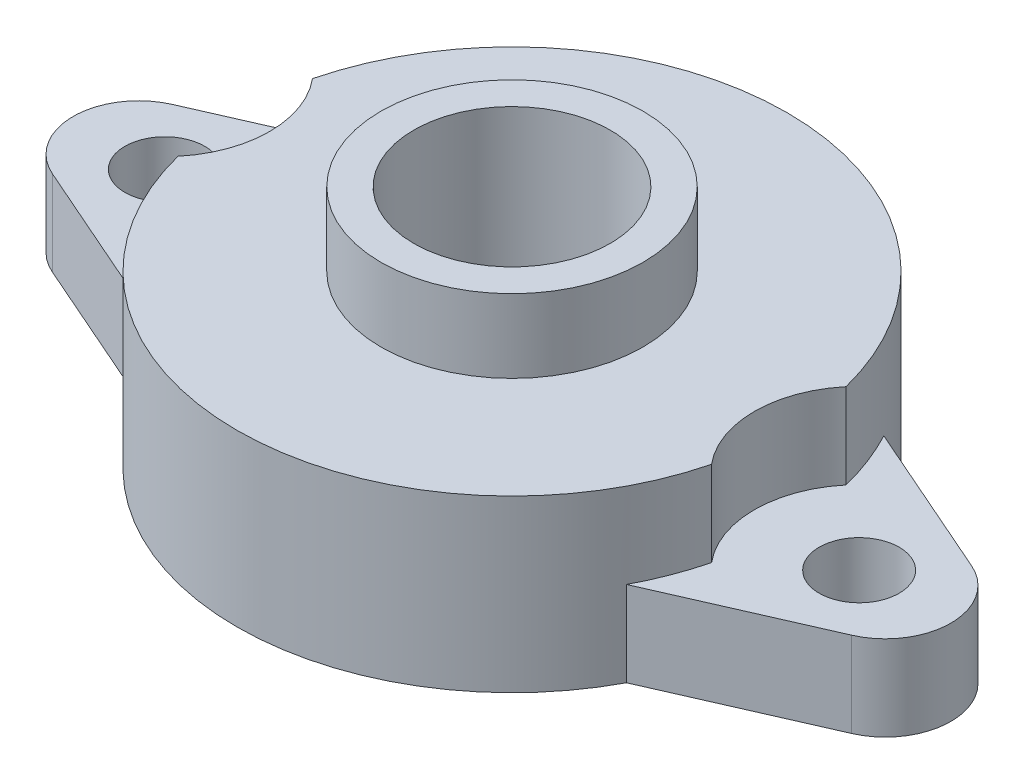
ISO-10303-21;
HEADER;
FILE_DESCRIPTION(('STEP AP214'),'2;1');
FILE_NAME('part.step','',(''),(''),'','','');
FILE_SCHEMA(('AUTOMOTIVE_DESIGN { 1 0 10303 214 1 1 1 1 }'));
ENDSEC;
DATA;
#1=APPLICATION_CONTEXT('core data for automotive mechanical design processes');
#2=APPLICATION_PROTOCOL_DEFINITION('international standard','automotive_design',2000,#1);
#3=PRODUCT_CONTEXT('',#1,'mechanical');
#4=PRODUCT('Part','Part','',(#3));
#5=PRODUCT_RELATED_PRODUCT_CATEGORY('part','',(#4));
#6=PRODUCT_DEFINITION_FORMATION('','',#4);
#7=PRODUCT_DEFINITION_CONTEXT('part definition',#1,'design');
#8=PRODUCT_DEFINITION('design','',#6,#7);
#9=PRODUCT_DEFINITION_SHAPE('','',#8);
#10=(LENGTH_UNIT() NAMED_UNIT(*) SI_UNIT(.MILLI.,.METRE.));
#11=(NAMED_UNIT(*) PLANE_ANGLE_UNIT() SI_UNIT($,.RADIAN.));
#12=(NAMED_UNIT(*) SI_UNIT($,.STERADIAN.) SOLID_ANGLE_UNIT());
#13=UNCERTAINTY_MEASURE_WITH_UNIT(LENGTH_MEASURE(1.E-05),#10,'distance_accuracy_value','');
#14=(GEOMETRIC_REPRESENTATION_CONTEXT(3) GLOBAL_UNCERTAINTY_ASSIGNED_CONTEXT((#13)) GLOBAL_UNIT_ASSIGNED_CONTEXT((#10,
#11,#12)) REPRESENTATION_CONTEXT('',''));
#15=CARTESIAN_POINT('',(0.,0.,0.));
#16=DIRECTION('',(0.,0.,1.));
#17=DIRECTION('',(1.,0.,0.));
#18=AXIS2_PLACEMENT_3D('',#15,#16,#17);
#19=CARTESIAN_POINT('',(0.,6.5,0.));
#20=DIRECTION('',(0.,1.,0.));
#21=DIRECTION('',(0.,0.,1.));
#22=AXIS2_PLACEMENT_3D('',#19,#20,#21);
#23=PLANE('',#22);
#24=CARTESIAN_POINT('',(-26.5,6.5,0.));
#25=DIRECTION('',(0.,1.,0.));
#26=DIRECTION('',(0.,0.,1.));
#27=AXIS2_PLACEMENT_3D('',#24,#25,#26);
#28=CIRCLE('',#27,3.05);
#29=CARTESIAN_POINT('',(-26.5,6.5,-3.04999999999999));
#30=VERTEX_POINT('',#29);
#31=EDGE_CURVE('E195',#30,#30,#28,.T.);
#32=ORIENTED_EDGE('',*,*,#31,.F.);
#33=EDGE_LOOP('',(#32));
#34=FACE_BOUND('',#33,.T.);
#35=CARTESIAN_POINT('',(0.,6.5,0.));
#36=DIRECTION('',(0.,1.,0.));
#37=DIRECTION('',(0.,0.,1.));
#38=AXIS2_PLACEMENT_3D('',#35,#36,#37);
#39=CIRCLE('',#38,21.);
#40=CARTESIAN_POINT('',(-20.3632075471698,6.5,5.13222937824164));
#41=VERTEX_POINT('',#40);
#42=CARTESIAN_POINT('',(-18.5617616197673,6.5,9.8214563874678));
#43=VERTEX_POINT('',#42);
#44=EDGE_CURVE('E63',#41,#43,#39,.T.);
#45=ORIENTED_EDGE('',*,*,#44,.F.);
#46=CARTESIAN_POINT('',(-26.5,6.5,0.));
#47=DIRECTION('',(0.,-1.,0.));
#48=DIRECTION('',(0.,0.,1.));
#49=AXIS2_PLACEMENT_3D('',#46,#47,#48);
#50=CIRCLE('',#49,8.);
#51=CARTESIAN_POINT('',(-20.3632075471698,6.5,-5.13222937824163));
#52=VERTEX_POINT('',#51);
#53=EDGE_CURVE('E67',#52,#41,#50,.T.);
#54=ORIENTED_EDGE('',*,*,#53,.F.);
#55=CARTESIAN_POINT('',(0.,6.5,0.));
#56=DIRECTION('',(0.,1.,0.));
#57=DIRECTION('',(0.,0.,1.));
#58=AXIS2_PLACEMENT_3D('',#55,#56,#57);
#59=CIRCLE('',#58,21.);
#60=CARTESIAN_POINT('',(-18.5617616197673,6.5,-9.8214563874678));
#61=VERTEX_POINT('',#60);
#62=EDGE_CURVE('E55',#61,#52,#59,.T.);
#63=ORIENTED_EDGE('',*,*,#62,.F.);
#64=DIRECTION('',(0.91570918494553,0.,-0.401841621296741));
#65=VECTOR('',#64,1.);
#66=CARTESIAN_POINT('',(-6.61129373176592,6.5,-15.0656927349003));
#67=LINE('',#66,#65);
#68=CARTESIAN_POINT('',(-30.5092081064837,6.5,-4.57854592472766));
#69=VERTEX_POINT('',#68);
#70=EDGE_CURVE('E184',#69,#61,#67,.T.);
#71=ORIENTED_EDGE('',*,*,#70,.F.);
#72=CARTESIAN_POINT('',(-28.5,6.5,0.));
#73=DIRECTION('',(0.,1.,0.));
#74=DIRECTION('',(0.,0.,1.));
#75=AXIS2_PLACEMENT_3D('',#72,#73,#74);
#76=CIRCLE('',#75,5.00000000000001);
#77=CARTESIAN_POINT('',(-30.5092081064837,6.5,4.57854592472766));
#78=VERTEX_POINT('',#77);
#79=EDGE_CURVE('E188',#78,#69,#76,.F.);
#80=ORIENTED_EDGE('',*,*,#79,.F.);
#81=DIRECTION('',(0.91570918494553,0.,0.401841621296741));
#82=VECTOR('',#81,1.);
#83=CARTESIAN_POINT('',(-6.61129373176592,6.5,15.0656927349003));
#84=LINE('',#83,#82);
#85=EDGE_CURVE('E192',#78,#43,#84,.T.);
#86=ORIENTED_EDGE('',*,*,#85,.T.);
#87=EDGE_LOOP('',(#45,#54,#63,#71,#80,#86));
#88=FACE_BOUND('',#87,.T.);
#89=ADVANCED_FACE('F45',(#34,#88),#23,.T.);
#90=CARTESIAN_POINT('',(26.5,6.5,0.));
#91=DIRECTION('',(0.,1.,0.));
#92=DIRECTION('',(0.,0.,1.));
#93=AXIS2_PLACEMENT_3D('',#90,#91,#92);
#94=CIRCLE('',#93,3.05);
#95=CARTESIAN_POINT('',(26.5,6.5,-3.05000000000001));
#96=VERTEX_POINT('',#95);
#97=EDGE_CURVE('E199',#96,#96,#94,.T.);
#98=ORIENTED_EDGE('',*,*,#97,.F.);
#99=EDGE_LOOP('',(#98));
#100=FACE_BOUND('',#99,.T.);
#101=CARTESIAN_POINT('',(18.5617616197674,6.5,9.82145638746779));
#102=VERTEX_POINT('',#101);
#103=CARTESIAN_POINT('',(20.3632075471698,6.5,5.13222937824163));
#104=VERTEX_POINT('',#103);
#105=EDGE_CURVE('E161',#102,#104,#39,.T.);
#106=ORIENTED_EDGE('',*,*,#105,.F.);
#107=DIRECTION('',(-0.91570918494553,0.,0.401841621296741));
#108=VECTOR('',#107,1.);
#109=CARTESIAN_POINT('',(6.61129373176592,6.5,15.0656927349003));
#110=LINE('',#109,#108);
#111=CARTESIAN_POINT('',(30.5092081064837,6.5,4.57854592472766));
#112=VERTEX_POINT('',#111);
#113=EDGE_CURVE('E173',#112,#102,#110,.T.);
#114=ORIENTED_EDGE('',*,*,#113,.F.);
#115=CARTESIAN_POINT('',(28.5,6.5,0.));
#116=DIRECTION('',(0.,1.,0.));
#117=DIRECTION('',(0.,0.,1.));
#118=AXIS2_PLACEMENT_3D('',#115,#116,#117);
#119=CIRCLE('',#118,5.00000000000001);
#120=CARTESIAN_POINT('',(30.5092081064837,6.5,-4.57854592472766));
#121=VERTEX_POINT('',#120);
#122=EDGE_CURVE('E177',#112,#121,#119,.T.);
#123=ORIENTED_EDGE('',*,*,#122,.T.);
#124=DIRECTION('',(-0.91570918494553,0.,-0.401841621296741));
#125=VECTOR('',#124,1.);
#126=CARTESIAN_POINT('',(6.61129373176592,6.5,-15.0656927349003));
#127=LINE('',#126,#125);
#128=CARTESIAN_POINT('',(18.5617616197674,6.5,-9.82145638746779));
#129=VERTEX_POINT('',#128);
#130=EDGE_CURVE('E181',#121,#129,#127,.T.);
#131=ORIENTED_EDGE('',*,*,#130,.T.);
#132=CARTESIAN_POINT('',(20.3632075471698,6.5,-5.13222937824164));
#133=VERTEX_POINT('',#132);
#134=EDGE_CURVE('E266',#133,#129,#59,.T.);
#135=ORIENTED_EDGE('',*,*,#134,.F.);
#136=CARTESIAN_POINT('',(26.5,6.5,0.));
#137=DIRECTION('',(0.,-1.,0.));
#138=DIRECTION('',(0.,0.,1.));
#139=AXIS2_PLACEMENT_3D('',#136,#137,#138);
#140=CIRCLE('',#139,8.);
#141=EDGE_CURVE('E270',#104,#133,#140,.T.);
#142=ORIENTED_EDGE('',*,*,#141,.F.);
#143=EDGE_LOOP('',(#106,#114,#123,#131,#135,#142));
#144=FACE_BOUND('',#143,.T.);
#145=ADVANCED_FACE('F301',(#100,#144),#23,.T.);
#146=CARTESIAN_POINT('',(0.,6.5,0.));
#147=DIRECTION('',(0.,-1.,0.));
#148=DIRECTION('',(0.,0.,-1.));
#149=AXIS2_PLACEMENT_3D('',#146,#147,#148);
#150=CYLINDRICAL_SURFACE('',#149,21.);
#151=CARTESIAN_POINT('',(0.,0.,0.));
#152=DIRECTION('',(0.,1.,0.));
#153=DIRECTION('',(0.,0.,1.));
#154=AXIS2_PLACEMENT_3D('',#151,#152,#153);
#155=CIRCLE('',#154,21.);
#156=CARTESIAN_POINT('',(-18.5617616197673,0.,9.8214563874678));
#157=VERTEX_POINT('',#156);
#158=CARTESIAN_POINT('',(18.5617616197674,0.,9.82145638746779));
#159=VERTEX_POINT('',#158);
#160=EDGE_CURVE('E163',#157,#159,#155,.T.);
#161=ORIENTED_EDGE('',*,*,#160,.T.);
#162=DIRECTION('',(0.,-1.,0.));
#163=VECTOR('',#162,1.);
#164=CARTESIAN_POINT('',(18.5617616197674,6.5,9.82145638746779));
#165=LINE('',#164,#163);
#166=EDGE_CURVE('E49',#102,#159,#165,.T.);
#167=ORIENTED_EDGE('',*,*,#166,.F.);
#168=ORIENTED_EDGE('',*,*,#105,.T.);
#169=DIRECTION('',(0.,-1.,0.));
#170=VECTOR('',#169,1.);
#171=CARTESIAN_POINT('',(20.3632075471698,13.,5.13222937824163));
#172=LINE('',#171,#170);
#173=CARTESIAN_POINT('',(20.3632075471698,13.,5.13222937824163));
#174=VERTEX_POINT('',#173);
#175=EDGE_CURVE('E140',#174,#104,#172,.T.);
#176=ORIENTED_EDGE('',*,*,#175,.F.);
#177=CARTESIAN_POINT('',(0.,13.,0.));
#178=DIRECTION('',(0.,1.,0.));
#179=DIRECTION('',(0.,0.,1.));
#180=AXIS2_PLACEMENT_3D('',#177,#178,#179);
#181=CIRCLE('',#180,21.);
#182=CARTESIAN_POINT('',(-20.3632075471698,13.,5.13222937824164));
#183=VERTEX_POINT('',#182);
#184=EDGE_CURVE('E147',#183,#174,#181,.T.);
#185=ORIENTED_EDGE('',*,*,#184,.F.);
#186=DIRECTION('',(0.,-1.,0.));
#187=VECTOR('',#186,1.);
#188=CARTESIAN_POINT('',(-20.3632075471698,13.,5.13222937824164));
#189=LINE('',#188,#187);
#190=EDGE_CURVE('E287',#183,#41,#189,.T.);
#191=ORIENTED_EDGE('',*,*,#190,.T.);
#192=ORIENTED_EDGE('',*,*,#44,.T.);
#193=DIRECTION('',(0.,-1.,0.));
#194=VECTOR('',#193,1.);
#195=CARTESIAN_POINT('',(-18.5617616197673,6.5,9.8214563874678));
#196=LINE('',#195,#194);
#197=EDGE_CURVE('E202',#43,#157,#196,.T.);
#198=ORIENTED_EDGE('',*,*,#197,.T.);
#199=EDGE_LOOP('',(#161,#167,#168,#176,#185,#191,#192,#198));
#200=FACE_BOUND('',#199,.T.);
#201=ADVANCED_FACE('F47',(#200),#150,.T.);
#202=CARTESIAN_POINT('',(6.61129373176592,6.5,15.0656927349003));
#203=DIRECTION('',(0.401841621296741,0.,0.91570918494553));
#204=DIRECTION('',(0.91570918494553,0.,-0.401841621296741));
#205=AXIS2_PLACEMENT_3D('',#202,#203,#204);
#206=PLANE('',#205);
#207=DIRECTION('',(-0.91570918494553,0.,0.401841621296741));
#208=VECTOR('',#207,1.);
#209=CARTESIAN_POINT('',(6.61129373176592,0.,15.0656927349003));
#210=LINE('',#209,#208);
#211=CARTESIAN_POINT('',(30.5092081064837,0.,4.57854592472766));
#212=VERTEX_POINT('',#211);
#213=EDGE_CURVE('E167',#212,#159,#210,.T.);
#214=ORIENTED_EDGE('',*,*,#213,.F.);
#215=DIRECTION('',(0.,-1.,0.));
#216=VECTOR('',#215,1.);
#217=CARTESIAN_POINT('',(30.5092081064837,6.5,4.57854592472766));
#218=LINE('',#217,#216);
#219=EDGE_CURVE('E254',#112,#212,#218,.T.);
#220=ORIENTED_EDGE('',*,*,#219,.F.);
#221=ORIENTED_EDGE('',*,*,#113,.T.);
#222=ORIENTED_EDGE('',*,*,#166,.T.);
#223=EDGE_LOOP('',(#214,#220,#221,#222));
#224=FACE_BOUND('',#223,.T.);
#225=ADVANCED_FACE('F327',(#224),#206,.T.);
#226=CARTESIAN_POINT('',(28.5,6.5,0.));
#227=DIRECTION('',(0.,-1.,0.));
#228=DIRECTION('',(0.,0.,-1.));
#229=AXIS2_PLACEMENT_3D('',#226,#227,#228);
#230=CYLINDRICAL_SURFACE('',#229,5.00000000000001);
#231=CARTESIAN_POINT('',(28.5,0.,0.));
#232=DIRECTION('',(0.,1.,0.));
#233=DIRECTION('',(0.,0.,1.));
#234=AXIS2_PLACEMENT_3D('',#231,#232,#233);
#235=CIRCLE('',#234,5.00000000000001);
#236=CARTESIAN_POINT('',(30.5092081064837,0.,-4.57854592472766));
#237=VERTEX_POINT('',#236);
#238=EDGE_CURVE('E207',#212,#237,#235,.T.);
#239=ORIENTED_EDGE('',*,*,#238,.T.);
#240=DIRECTION('',(0.,-1.,0.));
#241=VECTOR('',#240,1.);
#242=CARTESIAN_POINT('',(30.5092081064837,6.5,-4.57854592472766));
#243=LINE('',#242,#241);
#244=EDGE_CURVE('E251',#121,#237,#243,.T.);
#245=ORIENTED_EDGE('',*,*,#244,.F.);
#246=ORIENTED_EDGE('',*,*,#122,.F.);
#247=ORIENTED_EDGE('',*,*,#219,.T.);
#248=EDGE_LOOP('',(#239,#245,#246,#247));
#249=FACE_BOUND('',#248,.T.);
#250=ADVANCED_FACE('F328',(#249),#230,.T.);
#251=CARTESIAN_POINT('',(6.61129373176592,6.5,-15.0656927349003));
#252=DIRECTION('',(-0.401841621296741,0.,0.91570918494553));
#253=DIRECTION('',(0.91570918494553,0.,0.401841621296741));
#254=AXIS2_PLACEMENT_3D('',#251,#252,#253);
#255=PLANE('',#254);
#256=DIRECTION('',(-0.91570918494553,0.,-0.401841621296741));
#257=VECTOR('',#256,1.);
#258=CARTESIAN_POINT('',(6.61129373176592,0.,-15.0656927349003));
#259=LINE('',#258,#257);
#260=CARTESIAN_POINT('',(18.5617616197674,0.,-9.82145638746779));
#261=VERTEX_POINT('',#260);
#262=EDGE_CURVE('E210',#237,#261,#259,.T.);
#263=ORIENTED_EDGE('',*,*,#262,.T.);
#264=DIRECTION('',(0.,-1.,0.));
#265=VECTOR('',#264,1.);
#266=CARTESIAN_POINT('',(18.5617616197674,6.5,-9.82145638746779));
#267=LINE('',#266,#265);
#268=EDGE_CURVE('E247',#129,#261,#267,.T.);
#269=ORIENTED_EDGE('',*,*,#268,.F.);
#270=ORIENTED_EDGE('',*,*,#130,.F.);
#271=ORIENTED_EDGE('',*,*,#244,.T.);
#272=EDGE_LOOP('',(#263,#269,#270,#271));
#273=FACE_BOUND('',#272,.T.);
#274=ADVANCED_FACE('F306',(#273),#255,.F.);
#275=CARTESIAN_POINT('',(0.,6.5,0.));
#276=DIRECTION('',(0.,-1.,0.));
#277=DIRECTION('',(0.,0.,-1.));
#278=AXIS2_PLACEMENT_3D('',#275,#276,#277);
#279=CYLINDRICAL_SURFACE('',#278,21.);
#280=CARTESIAN_POINT('',(0.,0.,0.));
#281=DIRECTION('',(0.,1.,0.));
#282=DIRECTION('',(0.,0.,1.));
#283=AXIS2_PLACEMENT_3D('',#280,#281,#282);
#284=CIRCLE('',#283,21.);
#285=CARTESIAN_POINT('',(-18.5617616197673,0.,-9.8214563874678));
#286=VERTEX_POINT('',#285);
#287=EDGE_CURVE('E213',#261,#286,#284,.T.);
#288=ORIENTED_EDGE('',*,*,#287,.T.);
#289=DIRECTION('',(0.,-1.,0.));
#290=VECTOR('',#289,1.);
#291=CARTESIAN_POINT('',(-18.5617616197673,6.5,-9.8214563874678));
#292=LINE('',#291,#290);
#293=EDGE_CURVE('E244',#61,#286,#292,.T.);
#294=ORIENTED_EDGE('',*,*,#293,.F.);
#295=ORIENTED_EDGE('',*,*,#62,.T.);
#296=DIRECTION('',(0.,-1.,0.));
#297=VECTOR('',#296,1.);
#298=CARTESIAN_POINT('',(-20.3632075471698,13.,-5.13222937824163));
#299=LINE('',#298,#297);
#300=CARTESIAN_POINT('',(-20.3632075471698,13.,-5.13222937824163));
#301=VERTEX_POINT('',#300);
#302=EDGE_CURVE('E169',#301,#52,#299,.T.);
#303=ORIENTED_EDGE('',*,*,#302,.F.);
#304=CARTESIAN_POINT('',(0.,13.,0.));
#305=DIRECTION('',(0.,1.,0.));
#306=DIRECTION('',(0.,0.,1.));
#307=AXIS2_PLACEMENT_3D('',#304,#305,#306);
#308=CIRCLE('',#307,21.);
#309=CARTESIAN_POINT('',(20.3632075471698,13.,-5.13222937824164));
#310=VERTEX_POINT('',#309);
#311=EDGE_CURVE('E146',#310,#301,#308,.T.);
#312=ORIENTED_EDGE('',*,*,#311,.F.);
#313=DIRECTION('',(0.,-1.,0.));
#314=VECTOR('',#313,1.);
#315=CARTESIAN_POINT('',(20.3632075471698,13.,-5.13222937824164));
#316=LINE('',#315,#314);
#317=EDGE_CURVE('E142',#310,#133,#316,.T.);
#318=ORIENTED_EDGE('',*,*,#317,.T.);
#319=ORIENTED_EDGE('',*,*,#134,.T.);
#320=ORIENTED_EDGE('',*,*,#268,.T.);
#321=EDGE_LOOP('',(#288,#294,#295,#303,#312,#318,#319,#320));
#322=FACE_BOUND('',#321,.T.);
#323=ADVANCED_FACE('F297',(#322),#279,.T.);
#324=CARTESIAN_POINT('',(-6.61129373176592,6.5,-15.0656927349003));
#325=DIRECTION('',(-0.401841621296741,0.,-0.91570918494553));
#326=DIRECTION('',(-0.91570918494553,0.,0.401841621296741));
#327=AXIS2_PLACEMENT_3D('',#324,#325,#326);
#328=PLANE('',#327);
#329=DIRECTION('',(0.91570918494553,0.,-0.401841621296741));
#330=VECTOR('',#329,1.);
#331=CARTESIAN_POINT('',(-6.61129373176592,0.,-15.0656927349003));
#332=LINE('',#331,#330);
#333=CARTESIAN_POINT('',(-30.5092081064837,0.,-4.57854592472766));
#334=VERTEX_POINT('',#333);
#335=EDGE_CURVE('E217',#334,#286,#332,.T.);
#336=ORIENTED_EDGE('',*,*,#335,.F.);
#337=DIRECTION('',(0.,-1.,0.));
#338=VECTOR('',#337,1.);
#339=CARTESIAN_POINT('',(-30.5092081064837,6.5,-4.57854592472766));
#340=LINE('',#339,#338);
#341=EDGE_CURVE('E241',#69,#334,#340,.T.);
#342=ORIENTED_EDGE('',*,*,#341,.F.);
#343=ORIENTED_EDGE('',*,*,#70,.T.);
#344=ORIENTED_EDGE('',*,*,#293,.T.);
#345=EDGE_LOOP('',(#336,#342,#343,#344));
#346=FACE_BOUND('',#345,.T.);
#347=ADVANCED_FACE('F317',(#346),#328,.T.);
#348=CARTESIAN_POINT('',(-28.5,6.5,0.));
#349=DIRECTION('',(0.,-1.,0.));
#350=DIRECTION('',(0.,0.,-1.));
#351=AXIS2_PLACEMENT_3D('',#348,#349,#350);
#352=CYLINDRICAL_SURFACE('',#351,5.00000000000001);
#353=CARTESIAN_POINT('',(-28.5,0.,0.));
#354=DIRECTION('',(0.,1.,0.));
#355=DIRECTION('',(0.,0.,1.));
#356=AXIS2_PLACEMENT_3D('',#353,#354,#355);
#357=CIRCLE('',#356,5.00000000000001);
#358=CARTESIAN_POINT('',(-30.5092081064837,0.,4.57854592472766));
#359=VERTEX_POINT('',#358);
#360=EDGE_CURVE('E221',#359,#334,#357,.F.);
#361=ORIENTED_EDGE('',*,*,#360,.F.);
#362=DIRECTION('',(0.,-1.,0.));
#363=VECTOR('',#362,1.);
#364=CARTESIAN_POINT('',(-30.5092081064837,6.5,4.57854592472766));
#365=LINE('',#364,#363);
#366=EDGE_CURVE('E238',#78,#359,#365,.T.);
#367=ORIENTED_EDGE('',*,*,#366,.F.);
#368=ORIENTED_EDGE('',*,*,#79,.T.);
#369=ORIENTED_EDGE('',*,*,#341,.T.);
#370=EDGE_LOOP('',(#361,#367,#368,#369));
#371=FACE_BOUND('',#370,.T.);
#372=ADVANCED_FACE('F321',(#371),#352,.T.);
#373=CARTESIAN_POINT('',(-26.5,6.5,0.));
#374=DIRECTION('',(0.,-1.,0.));
#375=DIRECTION('',(0.,0.,-1.));
#376=AXIS2_PLACEMENT_3D('',#373,#374,#375);
#377=CYLINDRICAL_SURFACE('',#376,3.05);
#378=CARTESIAN_POINT('',(-26.5,0.,0.));
#379=DIRECTION('',(0.,1.,0.));
#380=DIRECTION('',(0.,0.,1.));
#381=AXIS2_PLACEMENT_3D('',#378,#379,#380);
#382=CIRCLE('',#381,3.05);
#383=CARTESIAN_POINT('',(-26.5,0.,-3.04999999999999));
#384=VERTEX_POINT('',#383);
#385=EDGE_CURVE('E228',#384,#384,#382,.T.);
#386=CARTESIAN_POINT('',(-26.5,6.5,-3.04999999999999));
#387=CARTESIAN_POINT('',(-26.5,6.43229166666667,-3.04999999999999));
#388=CARTESIAN_POINT('',(-26.5,6.36458333333333,-3.04999999999999));
#389=CARTESIAN_POINT('',(-26.5,6.22916666666667,-3.04999999999999));
#390=CARTESIAN_POINT('',(-26.5,6.16145833333333,-3.04999999999999));
#391=CARTESIAN_POINT('',(-26.5,6.02604166666667,-3.04999999999999));
#392=CARTESIAN_POINT('',(-26.5,5.95833333333333,-3.04999999999999));
#393=CARTESIAN_POINT('',(-26.5,5.82291666666667,-3.04999999999999));
#394=CARTESIAN_POINT('',(-26.5,5.75520833333333,-3.04999999999999));
#395=CARTESIAN_POINT('',(-26.5,5.61979166666667,-3.04999999999999));
#396=CARTESIAN_POINT('',(-26.5,5.55208333333333,-3.04999999999999));
#397=CARTESIAN_POINT('',(-26.5,5.41666666666667,-3.04999999999999));
#398=CARTESIAN_POINT('',(-26.5,5.34895833333333,-3.04999999999999));
#399=CARTESIAN_POINT('',(-26.5,5.21354166666667,-3.04999999999999));
#400=CARTESIAN_POINT('',(-26.5,5.14583333333333,-3.04999999999999));
#401=CARTESIAN_POINT('',(-26.5,5.01041666666667,-3.04999999999999));
#402=CARTESIAN_POINT('',(-26.5,4.94270833333333,-3.04999999999999));
#403=CARTESIAN_POINT('',(-26.5,4.80729166666667,-3.04999999999999));
#404=CARTESIAN_POINT('',(-26.5,4.73958333333333,-3.04999999999999));
#405=CARTESIAN_POINT('',(-26.5,4.60416666666667,-3.04999999999999));
#406=CARTESIAN_POINT('',(-26.5,4.53645833333333,-3.04999999999999));
#407=CARTESIAN_POINT('',(-26.5,4.40104166666667,-3.04999999999999));
#408=CARTESIAN_POINT('',(-26.5,4.33333333333333,-3.04999999999999));
#409=CARTESIAN_POINT('',(-26.5,4.19791666666667,-3.04999999999999));
#410=CARTESIAN_POINT('',(-26.5,4.13020833333333,-3.04999999999999));
#411=CARTESIAN_POINT('',(-26.5,3.99479166666667,-3.04999999999999));
#412=CARTESIAN_POINT('',(-26.5,3.92708333333333,-3.04999999999999));
#413=CARTESIAN_POINT('',(-26.5,3.79166666666667,-3.04999999999999));
#414=CARTESIAN_POINT('',(-26.5,3.72395833333333,-3.04999999999999));
#415=CARTESIAN_POINT('',(-26.5,3.58854166666667,-3.04999999999999));
#416=CARTESIAN_POINT('',(-26.5,3.52083333333333,-3.04999999999999));
#417=CARTESIAN_POINT('',(-26.5,3.38541666666667,-3.04999999999999));
#418=CARTESIAN_POINT('',(-26.5,3.31770833333333,-3.04999999999999));
#419=CARTESIAN_POINT('',(-26.5,3.18229166666667,-3.04999999999999));
#420=CARTESIAN_POINT('',(-26.5,3.11458333333333,-3.04999999999999));
#421=CARTESIAN_POINT('',(-26.5,2.97916666666667,-3.04999999999999));
#422=CARTESIAN_POINT('',(-26.5,2.91145833333333,-3.04999999999999));
#423=CARTESIAN_POINT('',(-26.5,2.77604166666667,-3.04999999999999));
#424=CARTESIAN_POINT('',(-26.5,2.70833333333333,-3.04999999999999));
#425=CARTESIAN_POINT('',(-26.5,2.57291666666667,-3.04999999999999));
#426=CARTESIAN_POINT('',(-26.5,2.50520833333333,-3.04999999999999));
#427=CARTESIAN_POINT('',(-26.5,2.36979166666667,-3.04999999999999));
#428=CARTESIAN_POINT('',(-26.5,2.30208333333333,-3.04999999999999));
#429=CARTESIAN_POINT('',(-26.5,2.16666666666667,-3.04999999999999));
#430=CARTESIAN_POINT('',(-26.5,2.09895833333333,-3.04999999999999));
#431=CARTESIAN_POINT('',(-26.5,1.96354166666667,-3.04999999999999));
#432=CARTESIAN_POINT('',(-26.5,1.89583333333333,-3.04999999999999));
#433=CARTESIAN_POINT('',(-26.5,1.76041666666667,-3.04999999999999));
#434=CARTESIAN_POINT('',(-26.5,1.69270833333333,-3.04999999999999));
#435=CARTESIAN_POINT('',(-26.5,1.55729166666667,-3.04999999999999));
#436=CARTESIAN_POINT('',(-26.5,1.48958333333333,-3.04999999999999));
#437=CARTESIAN_POINT('',(-26.5,1.35416666666667,-3.04999999999999));
#438=CARTESIAN_POINT('',(-26.5,1.28645833333333,-3.04999999999999));
#439=CARTESIAN_POINT('',(-26.5,1.15104166666667,-3.04999999999999));
#440=CARTESIAN_POINT('',(-26.5,1.08333333333333,-3.04999999999999));
#441=CARTESIAN_POINT('',(-26.5,0.947916666666667,-3.04999999999999));
#442=CARTESIAN_POINT('',(-26.5,0.880208333333333,-3.04999999999999));
#443=CARTESIAN_POINT('',(-26.5,0.744791666666667,-3.04999999999999));
#444=CARTESIAN_POINT('',(-26.5,0.677083333333333,-3.04999999999999));
#445=CARTESIAN_POINT('',(-26.5,0.541666666666667,-3.04999999999999));
#446=CARTESIAN_POINT('',(-26.5,0.473958333333333,-3.04999999999999));
#447=CARTESIAN_POINT('',(-26.5,0.338541666666667,-3.04999999999999));
#448=CARTESIAN_POINT('',(-26.5,0.270833333333334,-3.04999999999999));
#449=CARTESIAN_POINT('',(-26.5,0.135416666666667,-3.04999999999999));
#450=CARTESIAN_POINT('',(-26.5,0.0677083333333334,-3.04999999999999));
#451=CARTESIAN_POINT('',(-26.5,0.,-3.04999999999999));
#452=B_SPLINE_CURVE_WITH_KNOTS('',3,(#386,#387,#388,#389,#390,#391,#392,#393,#394,#395,#396,
#397,#398,#399,#400,#401,#402,#403,#404,#405,#406,#407,#408,#409,#410,#411,#412,#413,#414,#415,
#416,#417,#418,#419,#420,#421,#422,#423,#424,#425,#426,#427,#428,#429,#430,#431,#432,#433,#434,
#435,#436,#437,#438,#439,#440,#441,#442,#443,#444,#445,#446,#447,#448,#449,#450,#451),
.UNSPECIFIED.,.F.,.F.,(4,2,2,2,2,2,2,2,2,2,2,2,2,2,2,2,2,2,2,2,2,2,2,2,2,2,2,2,2,2,2,2,4),(0.,
0.203125,0.40625,0.609375000000001,0.812500000000001,1.015625,1.21875,1.421875,1.625,1.828125,
2.03125,2.234375,2.4375,2.640625,2.84375,3.046875,3.25,3.453125,3.65625,3.859375,4.0625,
4.265625,4.46875,4.671875,4.875,5.078125,5.28125,5.484375,5.6875,5.890625,6.09375,6.296875,6.5),.UNSPECIFIED.);
#453=EDGE_CURVE('BSEAM355',#30,#384,#452,.T.);
#454=ORIENTED_EDGE('',*,*,#31,.T.);
#455=ORIENTED_EDGE('',*,*,#385,.F.);
#456=ORIENTED_EDGE('',*,*,#453,.T.);
#457=ORIENTED_EDGE('',*,*,#453,.F.);
#458=EDGE_LOOP('',(#454,#456,#455,#457));
#459=FACE_BOUND('',#458,.T.);
#460=ADVANCED_FACE('F355',(#459),#377,.F.);
#461=CARTESIAN_POINT('',(-6.61129373176592,6.5,15.0656927349003));
#462=DIRECTION('',(0.401841621296741,0.,-0.91570918494553));
#463=DIRECTION('',(-0.91570918494553,0.,-0.401841621296741));
#464=AXIS2_PLACEMENT_3D('',#461,#462,#463);
#465=PLANE('',#464);
#466=DIRECTION('',(0.91570918494553,0.,0.401841621296741));
#467=VECTOR('',#466,1.);
#468=CARTESIAN_POINT('',(-6.61129373176592,0.,15.0656927349003));
#469=LINE('',#468,#467);
#470=EDGE_CURVE('E225',#359,#157,#469,.T.);
#471=ORIENTED_EDGE('',*,*,#470,.T.);
#472=ORIENTED_EDGE('',*,*,#197,.F.);
#473=ORIENTED_EDGE('',*,*,#85,.F.);
#474=ORIENTED_EDGE('',*,*,#366,.T.);
#475=EDGE_LOOP('',(#471,#472,#473,#474));
#476=FACE_BOUND('',#475,.T.);
#477=ADVANCED_FACE('F326',(#476),#465,.F.);
#478=CARTESIAN_POINT('',(26.5,6.5,0.));
#479=DIRECTION('',(0.,-1.,0.));
#480=DIRECTION('',(0.,0.,-1.));
#481=AXIS2_PLACEMENT_3D('',#478,#479,#480);
#482=CYLINDRICAL_SURFACE('',#481,3.05);
#483=CARTESIAN_POINT('',(26.5,0.,0.));
#484=DIRECTION('',(0.,1.,0.));
#485=DIRECTION('',(0.,0.,1.));
#486=AXIS2_PLACEMENT_3D('',#483,#484,#485);
#487=CIRCLE('',#486,3.05);
#488=CARTESIAN_POINT('',(26.5,0.,-3.05000000000001));
#489=VERTEX_POINT('',#488);
#490=EDGE_CURVE('E178',#489,#489,#487,.T.);
#491=CARTESIAN_POINT('',(26.5,6.5,-3.05000000000001));
#492=CARTESIAN_POINT('',(26.5,6.43229166666667,-3.05000000000001));
#493=CARTESIAN_POINT('',(26.5,6.36458333333333,-3.05000000000001));
#494=CARTESIAN_POINT('',(26.5,6.22916666666667,-3.05000000000001));
#495=CARTESIAN_POINT('',(26.5,6.16145833333333,-3.05000000000001));
#496=CARTESIAN_POINT('',(26.5,6.02604166666667,-3.05000000000001));
#497=CARTESIAN_POINT('',(26.5,5.95833333333333,-3.05000000000001));
#498=CARTESIAN_POINT('',(26.5,5.82291666666667,-3.05000000000001));
#499=CARTESIAN_POINT('',(26.5,5.75520833333333,-3.05000000000001));
#500=CARTESIAN_POINT('',(26.5,5.61979166666667,-3.05000000000001));
#501=CARTESIAN_POINT('',(26.5,5.55208333333333,-3.05000000000001));
#502=CARTESIAN_POINT('',(26.5,5.41666666666667,-3.05000000000001));
#503=CARTESIAN_POINT('',(26.5,5.34895833333333,-3.05000000000001));
#504=CARTESIAN_POINT('',(26.5,5.21354166666667,-3.05000000000001));
#505=CARTESIAN_POINT('',(26.5,5.14583333333333,-3.05000000000001));
#506=CARTESIAN_POINT('',(26.5,5.01041666666667,-3.05000000000001));
#507=CARTESIAN_POINT('',(26.5,4.94270833333333,-3.05000000000001));
#508=CARTESIAN_POINT('',(26.5,4.80729166666667,-3.05000000000001));
#509=CARTESIAN_POINT('',(26.5,4.73958333333333,-3.05000000000001));
#510=CARTESIAN_POINT('',(26.5,4.60416666666667,-3.05000000000001));
#511=CARTESIAN_POINT('',(26.5,4.53645833333333,-3.05000000000001));
#512=CARTESIAN_POINT('',(26.5,4.40104166666667,-3.05000000000001));
#513=CARTESIAN_POINT('',(26.5,4.33333333333333,-3.05000000000001));
#514=CARTESIAN_POINT('',(26.5,4.19791666666667,-3.05000000000001));
#515=CARTESIAN_POINT('',(26.5,4.13020833333333,-3.05000000000001));
#516=CARTESIAN_POINT('',(26.5,3.99479166666667,-3.05000000000001));
#517=CARTESIAN_POINT('',(26.5,3.92708333333333,-3.05000000000001));
#518=CARTESIAN_POINT('',(26.5,3.79166666666667,-3.05000000000001));
#519=CARTESIAN_POINT('',(26.5,3.72395833333333,-3.05000000000001));
#520=CARTESIAN_POINT('',(26.5,3.58854166666667,-3.05000000000001));
#521=CARTESIAN_POINT('',(26.5,3.52083333333333,-3.05000000000001));
#522=CARTESIAN_POINT('',(26.5,3.38541666666667,-3.05000000000001));
#523=CARTESIAN_POINT('',(26.5,3.31770833333333,-3.05000000000001));
#524=CARTESIAN_POINT('',(26.5,3.18229166666667,-3.05000000000001));
#525=CARTESIAN_POINT('',(26.5,3.11458333333333,-3.05000000000001));
#526=CARTESIAN_POINT('',(26.5,2.97916666666667,-3.05000000000001));
#527=CARTESIAN_POINT('',(26.5,2.91145833333333,-3.05000000000001));
#528=CARTESIAN_POINT('',(26.5,2.77604166666667,-3.05000000000001));
#529=CARTESIAN_POINT('',(26.5,2.70833333333333,-3.05000000000001));
#530=CARTESIAN_POINT('',(26.5,2.57291666666667,-3.05000000000001));
#531=CARTESIAN_POINT('',(26.5,2.50520833333333,-3.05000000000001));
#532=CARTESIAN_POINT('',(26.5,2.36979166666667,-3.05000000000001));
#533=CARTESIAN_POINT('',(26.5,2.30208333333333,-3.05000000000001));
#534=CARTESIAN_POINT('',(26.5,2.16666666666667,-3.05000000000001));
#535=CARTESIAN_POINT('',(26.5,2.09895833333333,-3.05000000000001));
#536=CARTESIAN_POINT('',(26.5,1.96354166666667,-3.05000000000001));
#537=CARTESIAN_POINT('',(26.5,1.89583333333333,-3.05000000000001));
#538=CARTESIAN_POINT('',(26.5,1.76041666666667,-3.05000000000001));
#539=CARTESIAN_POINT('',(26.5,1.69270833333333,-3.05000000000001));
#540=CARTESIAN_POINT('',(26.5,1.55729166666667,-3.05000000000001));
#541=CARTESIAN_POINT('',(26.5,1.48958333333333,-3.05000000000001));
#542=CARTESIAN_POINT('',(26.5,1.35416666666667,-3.05000000000001));
#543=CARTESIAN_POINT('',(26.5,1.28645833333333,-3.05000000000001));
#544=CARTESIAN_POINT('',(26.5,1.15104166666667,-3.05000000000001));
#545=CARTESIAN_POINT('',(26.5,1.08333333333333,-3.05000000000001));
#546=CARTESIAN_POINT('',(26.5,0.947916666666667,-3.05000000000001));
#547=CARTESIAN_POINT('',(26.5,0.880208333333333,-3.05000000000001));
#548=CARTESIAN_POINT('',(26.5,0.744791666666667,-3.05000000000001));
#549=CARTESIAN_POINT('',(26.5,0.677083333333333,-3.05000000000001));
#550=CARTESIAN_POINT('',(26.5,0.541666666666667,-3.05000000000001));
#551=CARTESIAN_POINT('',(26.5,0.473958333333333,-3.05000000000001));
#552=CARTESIAN_POINT('',(26.5,0.338541666666667,-3.05000000000001));
#553=CARTESIAN_POINT('',(26.5,0.270833333333334,-3.05000000000001));
#554=CARTESIAN_POINT('',(26.5,0.135416666666667,-3.05000000000001));
#555=CARTESIAN_POINT('',(26.5,0.0677083333333334,-3.05000000000001));
#556=CARTESIAN_POINT('',(26.5,0.,-3.05000000000001));
#557=B_SPLINE_CURVE_WITH_KNOTS('',3,(#491,#492,#493,#494,#495,#496,#497,#498,#499,#500,#501,
#502,#503,#504,#505,#506,#507,#508,#509,#510,#511,#512,#513,#514,#515,#516,#517,#518,#519,#520,
#521,#522,#523,#524,#525,#526,#527,#528,#529,#530,#531,#532,#533,#534,#535,#536,#537,#538,#539,
#540,#541,#542,#543,#544,#545,#546,#547,#548,#549,#550,#551,#552,#553,#554,#555,#556),
.UNSPECIFIED.,.F.,.F.,(4,2,2,2,2,2,2,2,2,2,2,2,2,2,2,2,2,2,2,2,2,2,2,2,2,2,2,2,2,2,2,2,4),(0.,
0.203125,0.40625,0.609375000000001,0.812500000000001,1.015625,1.21875,1.421875,1.625,1.828125,
2.03125,2.234375,2.4375,2.640625,2.84375,3.046875,3.25,3.453125,3.65625,3.859375,4.0625,
4.265625,4.46875,4.671875,4.875,5.078125,5.28125,5.484375,5.6875,5.890625,6.09375,6.296875,6.5),.UNSPECIFIED.);
#558=EDGE_CURVE('BSEAM351',#96,#489,#557,.T.);
#559=ORIENTED_EDGE('',*,*,#97,.T.);
#560=ORIENTED_EDGE('',*,*,#490,.F.);
#561=ORIENTED_EDGE('',*,*,#558,.T.);
#562=ORIENTED_EDGE('',*,*,#558,.F.);
#563=EDGE_LOOP('',(#559,#561,#560,#562));
#564=FACE_BOUND('',#563,.T.);
#565=ADVANCED_FACE('F351',(#564),#482,.F.);
#566=CARTESIAN_POINT('',(0.,0.,0.));
#567=DIRECTION('',(0.,1.,0.));
#568=DIRECTION('',(0.,0.,1.));
#569=AXIS2_PLACEMENT_3D('',#566,#567,#568);
#570=PLANE('',#569);
#571=CARTESIAN_POINT('',(0.,0.,0.));
#572=DIRECTION('',(0.,1.,0.));
#573=DIRECTION('',(0.,0.,1.));
#574=AXIS2_PLACEMENT_3D('',#571,#572,#573);
#575=CIRCLE('',#574,7.5);
#576=CARTESIAN_POINT('',(0.,0.,7.5));
#577=VERTEX_POINT('',#576);
#578=EDGE_CURVE('E275',#577,#577,#575,.T.);
#579=ORIENTED_EDGE('',*,*,#578,.T.);
#580=EDGE_LOOP('',(#579));
#581=FACE_BOUND('',#580,.T.);
#582=ORIENTED_EDGE('',*,*,#160,.F.);
#583=ORIENTED_EDGE('',*,*,#470,.F.);
#584=ORIENTED_EDGE('',*,*,#360,.T.);
#585=ORIENTED_EDGE('',*,*,#335,.T.);
#586=ORIENTED_EDGE('',*,*,#287,.F.);
#587=ORIENTED_EDGE('',*,*,#262,.F.);
#588=ORIENTED_EDGE('',*,*,#238,.F.);
#589=ORIENTED_EDGE('',*,*,#213,.T.);
#590=EDGE_LOOP('',(#582,#583,#584,#585,#586,#587,#588,#589));
#591=FACE_BOUND('',#590,.T.);
#592=ORIENTED_EDGE('',*,*,#385,.T.);
#593=EDGE_LOOP('',(#592));
#594=FACE_BOUND('',#593,.T.);
#595=ORIENTED_EDGE('',*,*,#490,.T.);
#596=EDGE_LOOP('',(#595));
#597=FACE_BOUND('',#596,.T.);
#598=ADVANCED_FACE('F310',(#581,#591,#594,#597),#570,.F.);
#599=CARTESIAN_POINT('',(26.5,13.,0.));
#600=DIRECTION('',(0.,-1.,0.));
#601=DIRECTION('',(0.,0.,-1.));
#602=AXIS2_PLACEMENT_3D('',#599,#600,#601);
#603=CYLINDRICAL_SURFACE('',#602,8.);
#604=ORIENTED_EDGE('',*,*,#141,.T.);
#605=ORIENTED_EDGE('',*,*,#317,.F.);
#606=CARTESIAN_POINT('',(26.5,13.,0.));
#607=DIRECTION('',(0.,-1.,0.));
#608=DIRECTION('',(0.,0.,1.));
#609=AXIS2_PLACEMENT_3D('',#606,#607,#608);
#610=CIRCLE('',#609,8.);
#611=EDGE_CURVE('E135',#174,#310,#610,.T.);
#612=ORIENTED_EDGE('',*,*,#611,.F.);
#613=ORIENTED_EDGE('',*,*,#175,.T.);
#614=EDGE_LOOP('',(#604,#605,#612,#613));
#615=FACE_BOUND('',#614,.T.);
#616=ADVANCED_FACE('F138',(#615),#603,.F.);
#617=CARTESIAN_POINT('',(-26.5,13.,0.));
#618=DIRECTION('',(0.,-1.,0.));
#619=DIRECTION('',(0.,0.,-1.));
#620=AXIS2_PLACEMENT_3D('',#617,#618,#619);
#621=CYLINDRICAL_SURFACE('',#620,8.);
#622=ORIENTED_EDGE('',*,*,#53,.T.);
#623=ORIENTED_EDGE('',*,*,#190,.F.);
#624=CARTESIAN_POINT('',(-26.5,13.,0.));
#625=DIRECTION('',(0.,-1.,0.));
#626=DIRECTION('',(0.,0.,1.));
#627=AXIS2_PLACEMENT_3D('',#624,#625,#626);
#628=CIRCLE('',#627,8.);
#629=EDGE_CURVE('E152',#301,#183,#628,.T.);
#630=ORIENTED_EDGE('',*,*,#629,.F.);
#631=ORIENTED_EDGE('',*,*,#302,.T.);
#632=EDGE_LOOP('',(#622,#623,#630,#631));
#633=FACE_BOUND('',#632,.T.);
#634=ADVANCED_FACE('F390',(#633),#621,.F.);
#635=CARTESIAN_POINT('',(13.25,13.,0.));
#636=DIRECTION('',(0.,1.,0.));
#637=DIRECTION('',(0.,0.,1.));
#638=AXIS2_PLACEMENT_3D('',#635,#636,#637);
#639=PLANE('',#638);
#640=CARTESIAN_POINT('',(0.,13.,0.));
#641=DIRECTION('',(0.,1.,0.));
#642=DIRECTION('',(0.,0.,1.));
#643=AXIS2_PLACEMENT_3D('',#640,#641,#642);
#644=CIRCLE('',#643,10.);
#645=CARTESIAN_POINT('',(0.,13.,10.));
#646=VERTEX_POINT('',#645);
#647=EDGE_CURVE('E11',#646,#646,#644,.T.);
#648=ORIENTED_EDGE('',*,*,#647,.F.);
#649=EDGE_LOOP('',(#648));
#650=FACE_BOUND('',#649,.T.);
#651=ORIENTED_EDGE('',*,*,#184,.T.);
#652=ORIENTED_EDGE('',*,*,#611,.T.);
#653=ORIENTED_EDGE('',*,*,#311,.T.);
#654=ORIENTED_EDGE('',*,*,#629,.T.);
#655=EDGE_LOOP('',(#651,#652,#653,#654));
#656=FACE_BOUND('',#655,.T.);
#657=ADVANCED_FACE('F150',(#650,#656),#639,.T.);
#658=CARTESIAN_POINT('',(0.,18.6,0.));
#659=DIRECTION('',(0.,-1.,0.));
#660=DIRECTION('',(0.,0.,-1.));
#661=AXIS2_PLACEMENT_3D('',#658,#659,#660);
#662=CYLINDRICAL_SURFACE('',#661,10.);
#663=CARTESIAN_POINT('',(0.,18.6,0.));
#664=DIRECTION('',(0.,1.,0.));
#665=DIRECTION('',(0.,0.,1.));
#666=AXIS2_PLACEMENT_3D('',#663,#664,#665);
#667=CIRCLE('',#666,10.);
#668=CARTESIAN_POINT('',(0.,18.6,10.));
#669=VERTEX_POINT('',#668);
#670=EDGE_CURVE('E271',#669,#669,#667,.T.);
#671=ORIENTED_EDGE('',*,*,#670,.F.);
#672=EDGE_LOOP('',(#671));
#673=FACE_BOUND('',#672,.T.);
#674=ORIENTED_EDGE('',*,*,#647,.T.);
#675=EDGE_LOOP('',(#674));
#676=FACE_BOUND('',#675,.T.);
#677=ADVANCED_FACE('F404',(#673,#676),#662,.T.);
#678=CARTESIAN_POINT('',(0.,18.6,0.));
#679=DIRECTION('',(0.,1.,0.));
#680=DIRECTION('',(0.,0.,1.));
#681=AXIS2_PLACEMENT_3D('',#678,#679,#680);
#682=PLANE('',#681);
#683=CARTESIAN_POINT('',(0.,18.6,0.));
#684=DIRECTION('',(0.,1.,0.));
#685=DIRECTION('',(0.,0.,1.));
#686=AXIS2_PLACEMENT_3D('',#683,#684,#685);
#687=CIRCLE('',#686,7.5);
#688=CARTESIAN_POINT('',(0.,18.6,7.5));
#689=VERTEX_POINT('',#688);
#690=EDGE_CURVE('E281',#689,#689,#687,.T.);
#691=ORIENTED_EDGE('',*,*,#690,.F.);
#692=EDGE_LOOP('',(#691));
#693=FACE_BOUND('',#692,.T.);
#694=ORIENTED_EDGE('',*,*,#670,.T.);
#695=EDGE_LOOP('',(#694));
#696=FACE_BOUND('',#695,.T.);
#697=ADVANCED_FACE('F412',(#693,#696),#682,.T.);
#698=CARTESIAN_POINT('',(0.,0.,0.));
#699=DIRECTION('',(0.,1.,0.));
#700=DIRECTION('',(0.,0.,1.));
#701=AXIS2_PLACEMENT_3D('',#698,#699,#700);
#702=CYLINDRICAL_SURFACE('',#701,7.5);
#703=ORIENTED_EDGE('',*,*,#578,.F.);
#704=EDGE_LOOP('',(#703));
#705=FACE_BOUND('',#704,.T.);
#706=ORIENTED_EDGE('',*,*,#690,.T.);
#707=EDGE_LOOP('',(#706));
#708=FACE_BOUND('',#707,.T.);
#709=ADVANCED_FACE('F428',(#705,#708),#702,.F.);
#710=CLOSED_SHELL('',(#89,#145,#201,#225,#250,#274,#323,#347,#372,#460,#477,#565,#598,#616,#634,
#657,#677,#697,#709));
#711=MANIFOLD_SOLID_BREP('B2',#710);
#712=ADVANCED_BREP_SHAPE_REPRESENTATION('',(#18,#711),#14);
#713=SHAPE_DEFINITION_REPRESENTATION(#9,#712);
ENDSEC;
END-ISO-10303-21;
